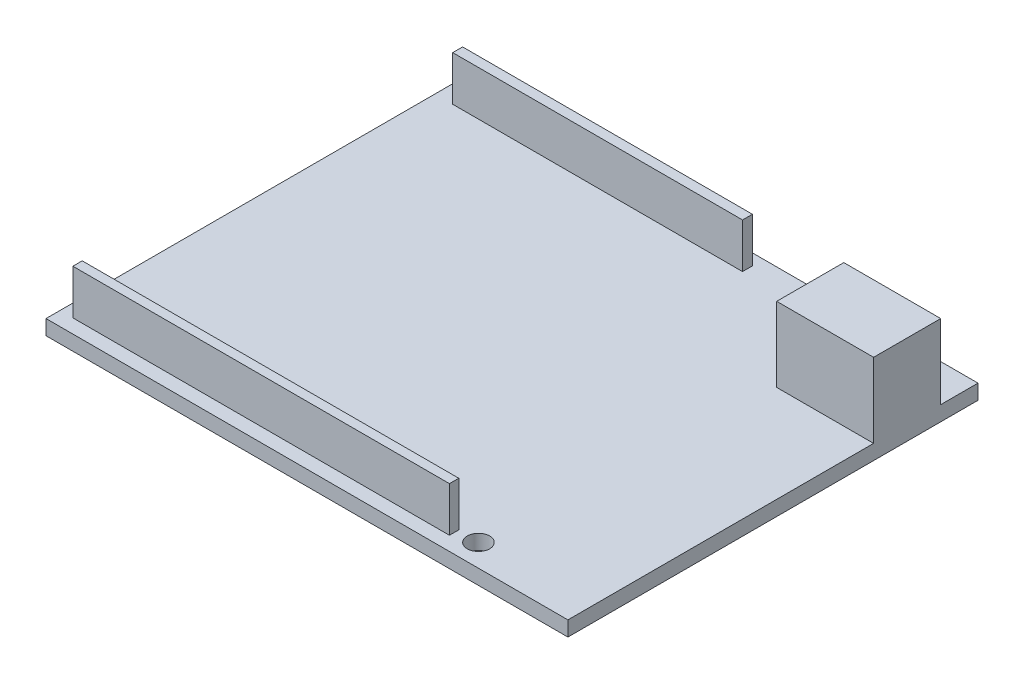
ISO-10303-21;
HEADER;
FILE_DESCRIPTION(('STEP AP214'),'2;1');
FILE_NAME('part.step','',(''),(''),'','','');
FILE_SCHEMA(('AUTOMOTIVE_DESIGN { 1 0 10303 214 1 1 1 1 }'));
ENDSEC;
DATA;
#1=APPLICATION_CONTEXT('core data for automotive mechanical design processes');
#2=APPLICATION_PROTOCOL_DEFINITION('international standard','automotive_design',2000,#1);
#3=PRODUCT_CONTEXT('',#1,'mechanical');
#4=PRODUCT('Part','Part','',(#3));
#5=PRODUCT_RELATED_PRODUCT_CATEGORY('part','',(#4));
#6=PRODUCT_DEFINITION_FORMATION('','',#4);
#7=PRODUCT_DEFINITION_CONTEXT('part definition',#1,'design');
#8=PRODUCT_DEFINITION('design','',#6,#7);
#9=PRODUCT_DEFINITION_SHAPE('','',#8);
#10=(LENGTH_UNIT() NAMED_UNIT(*) SI_UNIT(.MILLI.,.METRE.));
#11=(NAMED_UNIT(*) PLANE_ANGLE_UNIT() SI_UNIT($,.RADIAN.));
#12=(NAMED_UNIT(*) SI_UNIT($,.STERADIAN.) SOLID_ANGLE_UNIT());
#13=UNCERTAINTY_MEASURE_WITH_UNIT(LENGTH_MEASURE(1.E-05),#10,'distance_accuracy_value','');
#14=(GEOMETRIC_REPRESENTATION_CONTEXT(3) GLOBAL_UNCERTAINTY_ASSIGNED_CONTEXT((#13)) GLOBAL_UNIT_ASSIGNED_CONTEXT((#10,
#11,#12)) REPRESENTATION_CONTEXT('',''));
#15=CARTESIAN_POINT('',(0.,0.,0.));
#16=DIRECTION('',(0.,0.,1.));
#17=DIRECTION('',(1.,0.,0.));
#18=AXIS2_PLACEMENT_3D('',#15,#16,#17);
#19=CARTESIAN_POINT('',(0.,2.,0.));
#20=DIRECTION('',(0.,1.,0.));
#21=DIRECTION('',(0.,0.,1.));
#22=AXIS2_PLACEMENT_3D('',#19,#20,#21);
#23=PLANE('',#22);
#24=CARTESIAN_POINT('',(20.7,2.,-24.5));
#25=DIRECTION('',(0.,1.,0.));
#26=DIRECTION('',(0.,0.,1.));
#27=AXIS2_PLACEMENT_3D('',#24,#25,#26);
#28=CIRCLE('',#27,1.5);
#29=CARTESIAN_POINT('',(20.7,2.,-23.));
#30=VERTEX_POINT('',#29);
#31=EDGE_CURVE('E277',#30,#30,#28,.T.);
#32=ORIENTED_EDGE('',*,*,#31,.F.);
#33=EDGE_LOOP('',(#32));
#34=FACE_BOUND('',#33,.T.);
#35=CARTESIAN_POINT('',(20.,2.,24.5));
#36=DIRECTION('',(0.,1.,0.));
#37=DIRECTION('',(0.,0.,1.));
#38=AXIS2_PLACEMENT_3D('',#35,#36,#37);
#39=CIRCLE('',#38,1.5);
#40=CARTESIAN_POINT('',(20.,2.,26.));
#41=VERTEX_POINT('',#40);
#42=EDGE_CURVE('E267',#41,#41,#39,.T.);
#43=ORIENTED_EDGE('',*,*,#42,.F.);
#44=EDGE_LOOP('',(#43));
#45=FACE_BOUND('',#44,.T.);
#46=DIRECTION('',(1.,0.,0.));
#47=VECTOR('',#46,1.);
#48=CARTESIAN_POINT('',(35.,2.,-13.5));
#49=LINE('',#48,#47);
#50=CARTESIAN_POINT('',(22.,2.,-13.5));
#51=VERTEX_POINT('',#50);
#52=CARTESIAN_POINT('',(35.,2.,-13.5));
#53=VERTEX_POINT('',#52);
#54=EDGE_CURVE('E215',#51,#53,#49,.T.);
#55=ORIENTED_EDGE('',*,*,#54,.F.);
#56=DIRECTION('',(0.,0.,1.));
#57=VECTOR('',#56,1.);
#58=CARTESIAN_POINT('',(22.,2.,-22.5));
#59=LINE('',#58,#57);
#60=CARTESIAN_POINT('',(22.,2.,-22.5));
#61=VERTEX_POINT('',#60);
#62=EDGE_CURVE('E224',#61,#51,#59,.T.);
#63=ORIENTED_EDGE('',*,*,#62,.F.);
#64=DIRECTION('',(-1.,0.,0.));
#65=VECTOR('',#64,1.);
#66=CARTESIAN_POINT('',(35.,2.,-22.5));
#67=LINE('',#66,#65);
#68=CARTESIAN_POINT('',(35.,2.,-22.5));
#69=VERTEX_POINT('',#68);
#70=EDGE_CURVE('E210',#69,#61,#67,.T.);
#71=ORIENTED_EDGE('',*,*,#70,.F.);
#72=DIRECTION('',(0.,0.,-1.));
#73=VECTOR('',#72,1.);
#74=CARTESIAN_POINT('',(35.,2.,-27.5));
#75=LINE('',#74,#73);
#76=CARTESIAN_POINT('',(35.,2.,-27.5));
#77=VERTEX_POINT('',#76);
#78=EDGE_CURVE('E244',#69,#77,#75,.T.);
#79=ORIENTED_EDGE('',*,*,#78,.T.);
#80=DIRECTION('',(-1.,0.,0.));
#81=VECTOR('',#80,1.);
#82=CARTESIAN_POINT('',(-35.,2.,-27.5));
#83=LINE('',#82,#81);
#84=CARTESIAN_POINT('',(-35.,2.,-27.5));
#85=VERTEX_POINT('',#84);
#86=EDGE_CURVE('E243',#77,#85,#83,.T.);
#87=ORIENTED_EDGE('',*,*,#86,.T.);
#88=DIRECTION('',(0.,0.,1.));
#89=VECTOR('',#88,1.);
#90=CARTESIAN_POINT('',(-35.,2.,-27.5));
#91=LINE('',#90,#89);
#92=CARTESIAN_POINT('',(-35.,2.,27.5));
#93=VERTEX_POINT('',#92);
#94=EDGE_CURVE('E246',#85,#93,#91,.T.);
#95=ORIENTED_EDGE('',*,*,#94,.T.);
#96=DIRECTION('',(1.,0.,0.));
#97=VECTOR('',#96,1.);
#98=CARTESIAN_POINT('',(-35.,2.,27.5));
#99=LINE('',#98,#97);
#100=CARTESIAN_POINT('',(35.,2.,27.5));
#101=VERTEX_POINT('',#100);
#102=EDGE_CURVE('E248',#93,#101,#99,.T.);
#103=ORIENTED_EDGE('',*,*,#102,.T.);
#104=EDGE_CURVE('E241',#101,#53,#75,.T.);
#105=ORIENTED_EDGE('',*,*,#104,.T.);
#106=EDGE_LOOP('',(#55,#63,#71,#79,#87,#95,#103,#105));
#107=FACE_BOUND('',#106,.T.);
#108=DIRECTION('',(1.,0.,0.));
#109=VECTOR('',#108,1.);
#110=CARTESIAN_POINT('',(-32.613574237418,2.,-24.6626351456773));
#111=LINE('',#110,#109);
#112=CARTESIAN_POINT('',(-32.613574237418,2.,-24.6626351456773));
#113=VERTEX_POINT('',#112);
#114=CARTESIAN_POINT('',(6.25768354442557,2.,-24.6626351456773));
#115=VERTEX_POINT('',#114);
#116=EDGE_CURVE('E182',#113,#115,#111,.T.);
#117=ORIENTED_EDGE('',*,*,#116,.F.);
#118=DIRECTION('',(0.,0.,1.));
#119=VECTOR('',#118,1.);
#120=CARTESIAN_POINT('',(-32.613574237418,2.,-25.9877916609674));
#121=LINE('',#120,#119);
#122=CARTESIAN_POINT('',(-32.613574237418,2.,-25.9877916609674));
#123=VERTEX_POINT('',#122);
#124=EDGE_CURVE('E179',#123,#113,#121,.T.);
#125=ORIENTED_EDGE('',*,*,#124,.F.);
#126=DIRECTION('',(-1.,0.,0.));
#127=VECTOR('',#126,1.);
#128=CARTESIAN_POINT('',(-32.613574237418,2.,-25.9877916609674));
#129=LINE('',#128,#127);
#130=CARTESIAN_POINT('',(6.25768354442557,2.,-25.9877916609674));
#131=VERTEX_POINT('',#130);
#132=EDGE_CURVE('E191',#131,#123,#129,.T.);
#133=ORIENTED_EDGE('',*,*,#132,.F.);
#134=DIRECTION('',(0.,0.,-1.));
#135=VECTOR('',#134,1.);
#136=CARTESIAN_POINT('',(6.25768354442557,2.,-25.9877916609674));
#137=LINE('',#136,#135);
#138=EDGE_CURVE('E199',#115,#131,#137,.T.);
#139=ORIENTED_EDGE('',*,*,#138,.F.);
#140=EDGE_LOOP('',(#117,#125,#133,#139));
#141=FACE_BOUND('',#140,.T.);
#142=DIRECTION('',(1.,0.,0.));
#143=VECTOR('',#142,1.);
#144=CARTESIAN_POINT('',(-33.2761524950631,2.,25.6196926289424));
#145=LINE('',#144,#143);
#146=CARTESIAN_POINT('',(-33.2761524950631,2.,25.6196926289424));
#147=VERTEX_POINT('',#146);
#148=CARTESIAN_POINT('',(17.2270346987716,2.,25.6196926289424));
#149=VERTEX_POINT('',#148);
#150=EDGE_CURVE('E270',#147,#149,#145,.T.);
#151=ORIENTED_EDGE('',*,*,#150,.F.);
#152=DIRECTION('',(0.,0.,1.));
#153=VECTOR('',#152,1.);
#154=CARTESIAN_POINT('',(-33.2761524950631,2.,24.3681559200573));
#155=LINE('',#154,#153);
#156=CARTESIAN_POINT('',(-33.2761524950631,2.,24.3681559200573));
#157=VERTEX_POINT('',#156);
#158=EDGE_CURVE('E177',#157,#147,#155,.T.);
#159=ORIENTED_EDGE('',*,*,#158,.F.);
#160=DIRECTION('',(-1.,0.,0.));
#161=VECTOR('',#160,1.);
#162=CARTESIAN_POINT('',(-33.2761524950631,2.,24.3681559200573));
#163=LINE('',#162,#161);
#164=CARTESIAN_POINT('',(17.2270346987716,2.,24.3681559200573));
#165=VERTEX_POINT('',#164);
#166=EDGE_CURVE('E173',#165,#157,#163,.T.);
#167=ORIENTED_EDGE('',*,*,#166,.F.);
#168=DIRECTION('',(0.,0.,-1.));
#169=VECTOR('',#168,1.);
#170=CARTESIAN_POINT('',(17.2270346987716,2.,24.3681559200573));
#171=LINE('',#170,#169);
#172=EDGE_CURVE('E284',#149,#165,#171,.T.);
#173=ORIENTED_EDGE('',*,*,#172,.F.);
#174=EDGE_LOOP('',(#151,#159,#167,#173));
#175=FACE_BOUND('',#174,.T.);
#176=ADVANCED_FACE('F38',(#34,#45,#107,#141,#175),#23,.T.);
#177=CARTESIAN_POINT('',(35.,2.,-27.5));
#178=DIRECTION('',(-1.,0.,0.));
#179=DIRECTION('',(0.,0.,1.));
#180=AXIS2_PLACEMENT_3D('',#177,#178,#179);
#181=PLANE('',#180);
#182=DIRECTION('',(0.,0.,-1.));
#183=VECTOR('',#182,1.);
#184=CARTESIAN_POINT('',(35.,0.,-27.5));
#185=LINE('',#184,#183);
#186=CARTESIAN_POINT('',(35.,0.,27.5));
#187=VERTEX_POINT('',#186);
#188=CARTESIAN_POINT('',(35.,0.,-27.5));
#189=VERTEX_POINT('',#188);
#190=EDGE_CURVE('E240',#187,#189,#185,.T.);
#191=ORIENTED_EDGE('',*,*,#190,.T.);
#192=DIRECTION('',(0.,-1.,0.));
#193=VECTOR('',#192,1.);
#194=CARTESIAN_POINT('',(35.,2.,-27.5));
#195=LINE('',#194,#193);
#196=EDGE_CURVE('E11',#77,#189,#195,.T.);
#197=ORIENTED_EDGE('',*,*,#196,.F.);
#198=ORIENTED_EDGE('',*,*,#78,.F.);
#199=DIRECTION('',(0.,-1.,0.));
#200=VECTOR('',#199,1.);
#201=CARTESIAN_POINT('',(35.,12.,-22.5));
#202=LINE('',#201,#200);
#203=CARTESIAN_POINT('',(35.,12.,-22.5));
#204=VERTEX_POINT('',#203);
#205=EDGE_CURVE('E237',#204,#69,#202,.T.);
#206=ORIENTED_EDGE('',*,*,#205,.F.);
#207=DIRECTION('',(0.,0.,-1.));
#208=VECTOR('',#207,1.);
#209=CARTESIAN_POINT('',(35.,12.,-22.5));
#210=LINE('',#209,#208);
#211=CARTESIAN_POINT('',(35.,12.,-13.5));
#212=VERTEX_POINT('',#211);
#213=EDGE_CURVE('E211',#212,#204,#210,.T.);
#214=ORIENTED_EDGE('',*,*,#213,.F.);
#215=DIRECTION('',(0.,-1.,0.));
#216=VECTOR('',#215,1.);
#217=CARTESIAN_POINT('',(35.,12.,-13.5));
#218=LINE('',#217,#216);
#219=EDGE_CURVE('E221',#212,#53,#218,.T.);
#220=ORIENTED_EDGE('',*,*,#219,.T.);
#221=ORIENTED_EDGE('',*,*,#104,.F.);
#222=DIRECTION('',(0.,-1.,0.));
#223=VECTOR('',#222,1.);
#224=CARTESIAN_POINT('',(35.,2.,27.5));
#225=LINE('',#224,#223);
#226=EDGE_CURVE('E250',#101,#187,#225,.T.);
#227=ORIENTED_EDGE('',*,*,#226,.T.);
#228=EDGE_LOOP('',(#191,#197,#198,#206,#214,#220,#221,#227));
#229=FACE_BOUND('',#228,.T.);
#230=ADVANCED_FACE('F40',(#229),#181,.F.);
#231=CARTESIAN_POINT('',(-35.,2.,-27.5));
#232=DIRECTION('',(0.,0.,1.));
#233=DIRECTION('',(1.,0.,0.));
#234=AXIS2_PLACEMENT_3D('',#231,#232,#233);
#235=PLANE('',#234);
#236=DIRECTION('',(-1.,0.,0.));
#237=VECTOR('',#236,1.);
#238=CARTESIAN_POINT('',(-35.,0.,-27.5));
#239=LINE('',#238,#237);
#240=CARTESIAN_POINT('',(-35.,0.,-27.5));
#241=VERTEX_POINT('',#240);
#242=EDGE_CURVE('E253',#189,#241,#239,.T.);
#243=ORIENTED_EDGE('',*,*,#242,.T.);
#244=DIRECTION('',(0.,-1.,0.));
#245=VECTOR('',#244,1.);
#246=CARTESIAN_POINT('',(-35.,2.,-27.5));
#247=LINE('',#246,#245);
#248=EDGE_CURVE('E47',#85,#241,#247,.T.);
#249=ORIENTED_EDGE('',*,*,#248,.F.);
#250=ORIENTED_EDGE('',*,*,#86,.F.);
#251=ORIENTED_EDGE('',*,*,#196,.T.);
#252=EDGE_LOOP('',(#243,#249,#250,#251));
#253=FACE_BOUND('',#252,.T.);
#254=ADVANCED_FACE('F308',(#253),#235,.F.);
#255=CARTESIAN_POINT('',(-35.,2.,-27.5));
#256=DIRECTION('',(1.,0.,0.));
#257=DIRECTION('',(0.,0.,-1.));
#258=AXIS2_PLACEMENT_3D('',#255,#256,#257);
#259=PLANE('',#258);
#260=DIRECTION('',(0.,0.,1.));
#261=VECTOR('',#260,1.);
#262=CARTESIAN_POINT('',(-35.,0.,-27.5));
#263=LINE('',#262,#261);
#264=CARTESIAN_POINT('',(-35.,0.,27.5));
#265=VERTEX_POINT('',#264);
#266=EDGE_CURVE('E255',#241,#265,#263,.T.);
#267=ORIENTED_EDGE('',*,*,#266,.T.);
#268=DIRECTION('',(0.,-1.,0.));
#269=VECTOR('',#268,1.);
#270=CARTESIAN_POINT('',(-35.,2.,27.5));
#271=LINE('',#270,#269);
#272=EDGE_CURVE('E261',#93,#265,#271,.T.);
#273=ORIENTED_EDGE('',*,*,#272,.F.);
#274=ORIENTED_EDGE('',*,*,#94,.F.);
#275=ORIENTED_EDGE('',*,*,#248,.T.);
#276=EDGE_LOOP('',(#267,#273,#274,#275));
#277=FACE_BOUND('',#276,.T.);
#278=ADVANCED_FACE('F323',(#277),#259,.F.);
#279=CARTESIAN_POINT('',(-35.,2.,27.5));
#280=DIRECTION('',(0.,0.,-1.));
#281=DIRECTION('',(-1.,0.,0.));
#282=AXIS2_PLACEMENT_3D('',#279,#280,#281);
#283=PLANE('',#282);
#284=DIRECTION('',(1.,0.,0.));
#285=VECTOR('',#284,1.);
#286=CARTESIAN_POINT('',(-35.,0.,27.5));
#287=LINE('',#286,#285);
#288=EDGE_CURVE('E257',#265,#187,#287,.T.);
#289=ORIENTED_EDGE('',*,*,#288,.T.);
#290=ORIENTED_EDGE('',*,*,#226,.F.);
#291=ORIENTED_EDGE('',*,*,#102,.F.);
#292=ORIENTED_EDGE('',*,*,#272,.T.);
#293=EDGE_LOOP('',(#289,#290,#291,#292));
#294=FACE_BOUND('',#293,.T.);
#295=ADVANCED_FACE('F319',(#294),#283,.F.);
#296=CARTESIAN_POINT('',(0.,0.,0.));
#297=DIRECTION('',(0.,1.,0.));
#298=DIRECTION('',(0.,0.,1.));
#299=AXIS2_PLACEMENT_3D('',#296,#297,#298);
#300=PLANE('',#299);
#301=CARTESIAN_POINT('',(20.7,0.,-24.5));
#302=DIRECTION('',(0.,1.,0.));
#303=DIRECTION('',(0.,0.,1.));
#304=AXIS2_PLACEMENT_3D('',#301,#302,#303);
#305=CIRCLE('',#304,1.5);
#306=CARTESIAN_POINT('',(20.7,0.,-23.));
#307=VERTEX_POINT('',#306);
#308=EDGE_CURVE('E42',#307,#307,#305,.T.);
#309=ORIENTED_EDGE('',*,*,#308,.T.);
#310=EDGE_LOOP('',(#309));
#311=FACE_BOUND('',#310,.T.);
#312=CARTESIAN_POINT('',(20.,0.,24.5));
#313=DIRECTION('',(0.,1.,0.));
#314=DIRECTION('',(0.,0.,1.));
#315=AXIS2_PLACEMENT_3D('',#312,#313,#314);
#316=CIRCLE('',#315,1.5);
#317=CARTESIAN_POINT('',(20.,0.,26.));
#318=VERTEX_POINT('',#317);
#319=EDGE_CURVE('E265',#318,#318,#316,.T.);
#320=ORIENTED_EDGE('',*,*,#319,.T.);
#321=EDGE_LOOP('',(#320));
#322=FACE_BOUND('',#321,.T.);
#323=ORIENTED_EDGE('',*,*,#190,.F.);
#324=ORIENTED_EDGE('',*,*,#288,.F.);
#325=ORIENTED_EDGE('',*,*,#266,.F.);
#326=ORIENTED_EDGE('',*,*,#242,.F.);
#327=EDGE_LOOP('',(#323,#324,#325,#326));
#328=FACE_BOUND('',#327,.T.);
#329=ADVANCED_FACE('F316',(#311,#322,#328),#300,.F.);
#330=CARTESIAN_POINT('',(35.,12.,-22.5));
#331=DIRECTION('',(0.,0.,1.));
#332=DIRECTION('',(1.,0.,0.));
#333=AXIS2_PLACEMENT_3D('',#330,#331,#332);
#334=PLANE('',#333);
#335=ORIENTED_EDGE('',*,*,#70,.T.);
#336=DIRECTION('',(0.,-1.,0.));
#337=VECTOR('',#336,1.);
#338=CARTESIAN_POINT('',(22.,12.,-22.5));
#339=LINE('',#338,#337);
#340=CARTESIAN_POINT('',(22.,12.,-22.5));
#341=VERTEX_POINT('',#340);
#342=EDGE_CURVE('E234',#341,#61,#339,.T.);
#343=ORIENTED_EDGE('',*,*,#342,.F.);
#344=DIRECTION('',(-1.,0.,0.));
#345=VECTOR('',#344,1.);
#346=CARTESIAN_POINT('',(35.,12.,-22.5));
#347=LINE('',#346,#345);
#348=EDGE_CURVE('E214',#204,#341,#347,.T.);
#349=ORIENTED_EDGE('',*,*,#348,.F.);
#350=ORIENTED_EDGE('',*,*,#205,.T.);
#351=EDGE_LOOP('',(#335,#343,#349,#350));
#352=FACE_BOUND('',#351,.T.);
#353=ADVANCED_FACE('F314',(#352),#334,.F.);
#354=CARTESIAN_POINT('',(22.,12.,-22.5));
#355=DIRECTION('',(1.,0.,0.));
#356=DIRECTION('',(0.,0.,-1.));
#357=AXIS2_PLACEMENT_3D('',#354,#355,#356);
#358=PLANE('',#357);
#359=ORIENTED_EDGE('',*,*,#62,.T.);
#360=DIRECTION('',(0.,-1.,0.));
#361=VECTOR('',#360,1.);
#362=CARTESIAN_POINT('',(22.,12.,-13.5));
#363=LINE('',#362,#361);
#364=CARTESIAN_POINT('',(22.,12.,-13.5));
#365=VERTEX_POINT('',#364);
#366=EDGE_CURVE('E231',#365,#51,#363,.T.);
#367=ORIENTED_EDGE('',*,*,#366,.F.);
#368=DIRECTION('',(0.,0.,1.));
#369=VECTOR('',#368,1.);
#370=CARTESIAN_POINT('',(22.,12.,-22.5));
#371=LINE('',#370,#369);
#372=EDGE_CURVE('E217',#341,#365,#371,.T.);
#373=ORIENTED_EDGE('',*,*,#372,.F.);
#374=ORIENTED_EDGE('',*,*,#342,.T.);
#375=EDGE_LOOP('',(#359,#367,#373,#374));
#376=FACE_BOUND('',#375,.T.);
#377=ADVANCED_FACE('F353',(#376),#358,.F.);
#378=CARTESIAN_POINT('',(35.,12.,-13.5));
#379=DIRECTION('',(0.,0.,-1.));
#380=DIRECTION('',(-1.,0.,0.));
#381=AXIS2_PLACEMENT_3D('',#378,#379,#380);
#382=PLANE('',#381);
#383=ORIENTED_EDGE('',*,*,#54,.T.);
#384=ORIENTED_EDGE('',*,*,#219,.F.);
#385=DIRECTION('',(1.,0.,0.));
#386=VECTOR('',#385,1.);
#387=CARTESIAN_POINT('',(35.,12.,-13.5));
#388=LINE('',#387,#386);
#389=EDGE_CURVE('E219',#365,#212,#388,.T.);
#390=ORIENTED_EDGE('',*,*,#389,.F.);
#391=ORIENTED_EDGE('',*,*,#366,.T.);
#392=EDGE_LOOP('',(#383,#384,#390,#391));
#393=FACE_BOUND('',#392,.T.);
#394=ADVANCED_FACE('F348',(#393),#382,.F.);
#395=CARTESIAN_POINT('',(0.,12.,0.));
#396=DIRECTION('',(0.,-1.,0.));
#397=DIRECTION('',(0.,0.,-1.));
#398=AXIS2_PLACEMENT_3D('',#395,#396,#397);
#399=PLANE('',#398);
#400=ORIENTED_EDGE('',*,*,#213,.T.);
#401=ORIENTED_EDGE('',*,*,#348,.T.);
#402=ORIENTED_EDGE('',*,*,#372,.T.);
#403=ORIENTED_EDGE('',*,*,#389,.T.);
#404=EDGE_LOOP('',(#400,#401,#402,#403));
#405=FACE_BOUND('',#404,.T.);
#406=ADVANCED_FACE('F359',(#405),#399,.F.);
#407=CARTESIAN_POINT('',(-32.613574237418,8.,-25.9877916609674));
#408=DIRECTION('',(1.,0.,0.));
#409=DIRECTION('',(0.,0.,-1.));
#410=AXIS2_PLACEMENT_3D('',#407,#408,#409);
#411=PLANE('',#410);
#412=ORIENTED_EDGE('',*,*,#124,.T.);
#413=DIRECTION('',(0.,-1.,0.));
#414=VECTOR('',#413,1.);
#415=CARTESIAN_POINT('',(-32.613574237418,8.,-24.6626351456773));
#416=LINE('',#415,#414);
#417=CARTESIAN_POINT('',(-32.613574237418,8.,-24.6626351456773));
#418=VERTEX_POINT('',#417);
#419=EDGE_CURVE('E208',#418,#113,#416,.T.);
#420=ORIENTED_EDGE('',*,*,#419,.F.);
#421=DIRECTION('',(0.,0.,1.));
#422=VECTOR('',#421,1.);
#423=CARTESIAN_POINT('',(-32.613574237418,8.,-25.9877916609674));
#424=LINE('',#423,#422);
#425=CARTESIAN_POINT('',(-32.613574237418,8.,-25.9877916609674));
#426=VERTEX_POINT('',#425);
#427=EDGE_CURVE('E187',#426,#418,#424,.T.);
#428=ORIENTED_EDGE('',*,*,#427,.F.);
#429=DIRECTION('',(0.,-1.,0.));
#430=VECTOR('',#429,1.);
#431=CARTESIAN_POINT('',(-32.613574237418,8.,-25.9877916609674));
#432=LINE('',#431,#430);
#433=EDGE_CURVE('E196',#426,#123,#432,.T.);
#434=ORIENTED_EDGE('',*,*,#433,.T.);
#435=EDGE_LOOP('',(#412,#420,#428,#434));
#436=FACE_BOUND('',#435,.T.);
#437=ADVANCED_FACE('F361',(#436),#411,.F.);
#438=CARTESIAN_POINT('',(-32.613574237418,8.,-24.6626351456773));
#439=DIRECTION('',(0.,0.,-1.));
#440=DIRECTION('',(-1.,0.,0.));
#441=AXIS2_PLACEMENT_3D('',#438,#439,#440);
#442=PLANE('',#441);
#443=ORIENTED_EDGE('',*,*,#116,.T.);
#444=DIRECTION('',(0.,-1.,0.));
#445=VECTOR('',#444,1.);
#446=CARTESIAN_POINT('',(6.25768354442557,8.,-24.6626351456773));
#447=LINE('',#446,#445);
#448=CARTESIAN_POINT('',(6.25768354442557,8.,-24.6626351456773));
#449=VERTEX_POINT('',#448);
#450=EDGE_CURVE('E205',#449,#115,#447,.T.);
#451=ORIENTED_EDGE('',*,*,#450,.F.);
#452=DIRECTION('',(1.,0.,0.));
#453=VECTOR('',#452,1.);
#454=CARTESIAN_POINT('',(-32.613574237418,8.,-24.6626351456773));
#455=LINE('',#454,#453);
#456=EDGE_CURVE('E190',#418,#449,#455,.T.);
#457=ORIENTED_EDGE('',*,*,#456,.F.);
#458=ORIENTED_EDGE('',*,*,#419,.T.);
#459=EDGE_LOOP('',(#443,#451,#457,#458));
#460=FACE_BOUND('',#459,.T.);
#461=ADVANCED_FACE('F367',(#460),#442,.F.);
#462=CARTESIAN_POINT('',(6.25768354442557,8.,-25.9877916609674));
#463=DIRECTION('',(-1.,0.,0.));
#464=DIRECTION('',(0.,0.,1.));
#465=AXIS2_PLACEMENT_3D('',#462,#463,#464);
#466=PLANE('',#465);
#467=ORIENTED_EDGE('',*,*,#138,.T.);
#468=DIRECTION('',(0.,-1.,0.));
#469=VECTOR('',#468,1.);
#470=CARTESIAN_POINT('',(6.25768354442557,8.,-25.9877916609674));
#471=LINE('',#470,#469);
#472=CARTESIAN_POINT('',(6.25768354442557,8.,-25.9877916609674));
#473=VERTEX_POINT('',#472);
#474=EDGE_CURVE('E63',#473,#131,#471,.T.);
#475=ORIENTED_EDGE('',*,*,#474,.F.);
#476=DIRECTION('',(0.,0.,-1.));
#477=VECTOR('',#476,1.);
#478=CARTESIAN_POINT('',(6.25768354442557,8.,-25.9877916609674));
#479=LINE('',#478,#477);
#480=EDGE_CURVE('E193',#449,#473,#479,.T.);
#481=ORIENTED_EDGE('',*,*,#480,.F.);
#482=ORIENTED_EDGE('',*,*,#450,.T.);
#483=EDGE_LOOP('',(#467,#475,#481,#482));
#484=FACE_BOUND('',#483,.T.);
#485=ADVANCED_FACE('F441',(#484),#466,.F.);
#486=CARTESIAN_POINT('',(-32.613574237418,8.,-25.9877916609674));
#487=DIRECTION('',(0.,0.,1.));
#488=DIRECTION('',(1.,0.,0.));
#489=AXIS2_PLACEMENT_3D('',#486,#487,#488);
#490=PLANE('',#489);
#491=ORIENTED_EDGE('',*,*,#132,.T.);
#492=ORIENTED_EDGE('',*,*,#433,.F.);
#493=DIRECTION('',(-1.,0.,0.));
#494=VECTOR('',#493,1.);
#495=CARTESIAN_POINT('',(-32.613574237418,8.,-25.9877916609674));
#496=LINE('',#495,#494);
#497=EDGE_CURVE('E195',#473,#426,#496,.T.);
#498=ORIENTED_EDGE('',*,*,#497,.F.);
#499=ORIENTED_EDGE('',*,*,#474,.T.);
#500=EDGE_LOOP('',(#491,#492,#498,#499));
#501=FACE_BOUND('',#500,.T.);
#502=ADVANCED_FACE('F449',(#501),#490,.F.);
#503=CARTESIAN_POINT('',(0.,8.,0.));
#504=DIRECTION('',(0.,1.,0.));
#505=DIRECTION('',(0.,0.,1.));
#506=AXIS2_PLACEMENT_3D('',#503,#504,#505);
#507=PLANE('',#506);
#508=ORIENTED_EDGE('',*,*,#427,.T.);
#509=ORIENTED_EDGE('',*,*,#456,.T.);
#510=ORIENTED_EDGE('',*,*,#480,.T.);
#511=ORIENTED_EDGE('',*,*,#497,.T.);
#512=EDGE_LOOP('',(#508,#509,#510,#511));
#513=FACE_BOUND('',#512,.T.);
#514=ADVANCED_FACE('F458',(#513),#507,.T.);
#515=CARTESIAN_POINT('',(-33.2761524950631,8.,24.3681559200573));
#516=DIRECTION('',(1.,0.,0.));
#517=DIRECTION('',(0.,0.,-1.));
#518=AXIS2_PLACEMENT_3D('',#515,#516,#517);
#519=PLANE('',#518);
#520=ORIENTED_EDGE('',*,*,#158,.T.);
#521=DIRECTION('',(0.,-1.,0.));
#522=VECTOR('',#521,1.);
#523=CARTESIAN_POINT('',(-33.2761524950631,8.,25.6196926289424));
#524=LINE('',#523,#522);
#525=CARTESIAN_POINT('',(-33.2761524950631,8.,25.6196926289424));
#526=VERTEX_POINT('',#525);
#527=EDGE_CURVE('E158',#526,#147,#524,.T.);
#528=ORIENTED_EDGE('',*,*,#527,.F.);
#529=DIRECTION('',(0.,0.,1.));
#530=VECTOR('',#529,1.);
#531=CARTESIAN_POINT('',(-33.2761524950631,8.,24.3681559200573));
#532=LINE('',#531,#530);
#533=CARTESIAN_POINT('',(-33.2761524950631,8.,24.3681559200573));
#534=VERTEX_POINT('',#533);
#535=EDGE_CURVE('E165',#534,#526,#532,.T.);
#536=ORIENTED_EDGE('',*,*,#535,.F.);
#537=DIRECTION('',(0.,-1.,0.));
#538=VECTOR('',#537,1.);
#539=CARTESIAN_POINT('',(-33.2761524950631,8.,24.3681559200573));
#540=LINE('',#539,#538);
#541=EDGE_CURVE('E281',#534,#157,#540,.T.);
#542=ORIENTED_EDGE('',*,*,#541,.T.);
#543=EDGE_LOOP('',(#520,#528,#536,#542));
#544=FACE_BOUND('',#543,.T.);
#545=ADVANCED_FACE('F175',(#544),#519,.F.);
#546=CARTESIAN_POINT('',(-33.2761524950631,8.,25.6196926289424));
#547=DIRECTION('',(0.,0.,-1.));
#548=DIRECTION('',(-1.,0.,0.));
#549=AXIS2_PLACEMENT_3D('',#546,#547,#548);
#550=PLANE('',#549);
#551=ORIENTED_EDGE('',*,*,#150,.T.);
#552=DIRECTION('',(0.,-1.,0.));
#553=VECTOR('',#552,1.);
#554=CARTESIAN_POINT('',(17.2270346987716,8.,25.6196926289424));
#555=LINE('',#554,#553);
#556=CARTESIAN_POINT('',(17.2270346987716,8.,25.6196926289424));
#557=VERTEX_POINT('',#556);
#558=EDGE_CURVE('E161',#557,#149,#555,.T.);
#559=ORIENTED_EDGE('',*,*,#558,.F.);
#560=DIRECTION('',(1.,0.,0.));
#561=VECTOR('',#560,1.);
#562=CARTESIAN_POINT('',(-33.2761524950631,8.,25.6196926289424));
#563=LINE('',#562,#561);
#564=EDGE_CURVE('E154',#526,#557,#563,.T.);
#565=ORIENTED_EDGE('',*,*,#564,.F.);
#566=ORIENTED_EDGE('',*,*,#527,.T.);
#567=EDGE_LOOP('',(#551,#559,#565,#566));
#568=FACE_BOUND('',#567,.T.);
#569=ADVANCED_FACE('F156',(#568),#550,.F.);
#570=CARTESIAN_POINT('',(17.2270346987716,8.,24.3681559200573));
#571=DIRECTION('',(-1.,0.,0.));
#572=DIRECTION('',(0.,0.,1.));
#573=AXIS2_PLACEMENT_3D('',#570,#571,#572);
#574=PLANE('',#573);
#575=ORIENTED_EDGE('',*,*,#172,.T.);
#576=DIRECTION('',(0.,-1.,0.));
#577=VECTOR('',#576,1.);
#578=CARTESIAN_POINT('',(17.2270346987716,8.,24.3681559200573));
#579=LINE('',#578,#577);
#580=CARTESIAN_POINT('',(17.2270346987716,8.,24.3681559200573));
#581=VERTEX_POINT('',#580);
#582=EDGE_CURVE('E55',#581,#165,#579,.T.);
#583=ORIENTED_EDGE('',*,*,#582,.F.);
#584=DIRECTION('',(0.,0.,-1.));
#585=VECTOR('',#584,1.);
#586=CARTESIAN_POINT('',(17.2270346987716,8.,24.3681559200573));
#587=LINE('',#586,#585);
#588=EDGE_CURVE('E164',#557,#581,#587,.T.);
#589=ORIENTED_EDGE('',*,*,#588,.F.);
#590=ORIENTED_EDGE('',*,*,#558,.T.);
#591=EDGE_LOOP('',(#575,#583,#589,#590));
#592=FACE_BOUND('',#591,.T.);
#593=ADVANCED_FACE('F291',(#592),#574,.F.);
#594=CARTESIAN_POINT('',(-33.2761524950631,8.,24.3681559200573));
#595=DIRECTION('',(0.,0.,1.));
#596=DIRECTION('',(1.,0.,0.));
#597=AXIS2_PLACEMENT_3D('',#594,#595,#596);
#598=PLANE('',#597);
#599=ORIENTED_EDGE('',*,*,#166,.T.);
#600=ORIENTED_EDGE('',*,*,#541,.F.);
#601=DIRECTION('',(-1.,0.,0.));
#602=VECTOR('',#601,1.);
#603=CARTESIAN_POINT('',(-33.2761524950631,8.,24.3681559200573));
#604=LINE('',#603,#602);
#605=EDGE_CURVE('E169',#581,#534,#604,.T.);
#606=ORIENTED_EDGE('',*,*,#605,.F.);
#607=ORIENTED_EDGE('',*,*,#582,.T.);
#608=EDGE_LOOP('',(#599,#600,#606,#607));
#609=FACE_BOUND('',#608,.T.);
#610=ADVANCED_FACE('F292',(#609),#598,.F.);
#611=CARTESIAN_POINT('',(0.,8.,0.));
#612=DIRECTION('',(0.,1.,0.));
#613=DIRECTION('',(0.,0.,1.));
#614=AXIS2_PLACEMENT_3D('',#611,#612,#613);
#615=PLANE('',#614);
#616=ORIENTED_EDGE('',*,*,#535,.T.);
#617=ORIENTED_EDGE('',*,*,#564,.T.);
#618=ORIENTED_EDGE('',*,*,#588,.T.);
#619=ORIENTED_EDGE('',*,*,#605,.T.);
#620=EDGE_LOOP('',(#616,#617,#618,#619));
#621=FACE_BOUND('',#620,.T.);
#622=ADVANCED_FACE('F168',(#621),#615,.T.);
#623=CARTESIAN_POINT('',(20.,-4.,24.5));
#624=DIRECTION('',(0.,1.,0.));
#625=DIRECTION('',(0.,0.,1.));
#626=AXIS2_PLACEMENT_3D('',#623,#624,#625);
#627=CYLINDRICAL_SURFACE('',#626,1.5);
#628=ORIENTED_EDGE('',*,*,#42,.T.);
#629=EDGE_LOOP('',(#628));
#630=FACE_BOUND('',#629,.T.);
#631=ORIENTED_EDGE('',*,*,#319,.F.);
#632=EDGE_LOOP('',(#631));
#633=FACE_BOUND('',#632,.T.);
#634=ADVANCED_FACE('F299',(#630,#633),#627,.F.);
#635=CARTESIAN_POINT('',(20.7,-4.,-24.5));
#636=DIRECTION('',(0.,1.,0.));
#637=DIRECTION('',(0.,0.,1.));
#638=AXIS2_PLACEMENT_3D('',#635,#636,#637);
#639=CYLINDRICAL_SURFACE('',#638,1.5);
#640=ORIENTED_EDGE('',*,*,#31,.T.);
#641=EDGE_LOOP('',(#640));
#642=FACE_BOUND('',#641,.T.);
#643=ORIENTED_EDGE('',*,*,#308,.F.);
#644=EDGE_LOOP('',(#643));
#645=FACE_BOUND('',#644,.T.);
#646=ADVANCED_FACE('F501',(#642,#645),#639,.F.);
#647=CLOSED_SHELL('',(#176,#230,#254,#278,#295,#329,#353,#377,#394,#406,#437,#461,#485,#502,
#514,#545,#569,#593,#610,#622,#634,#646));
#648=MANIFOLD_SOLID_BREP('B2',#647);
#649=ADVANCED_BREP_SHAPE_REPRESENTATION('',(#18,#648),#14);
#650=SHAPE_DEFINITION_REPRESENTATION(#9,#649);
ENDSEC;
END-ISO-10303-21;
